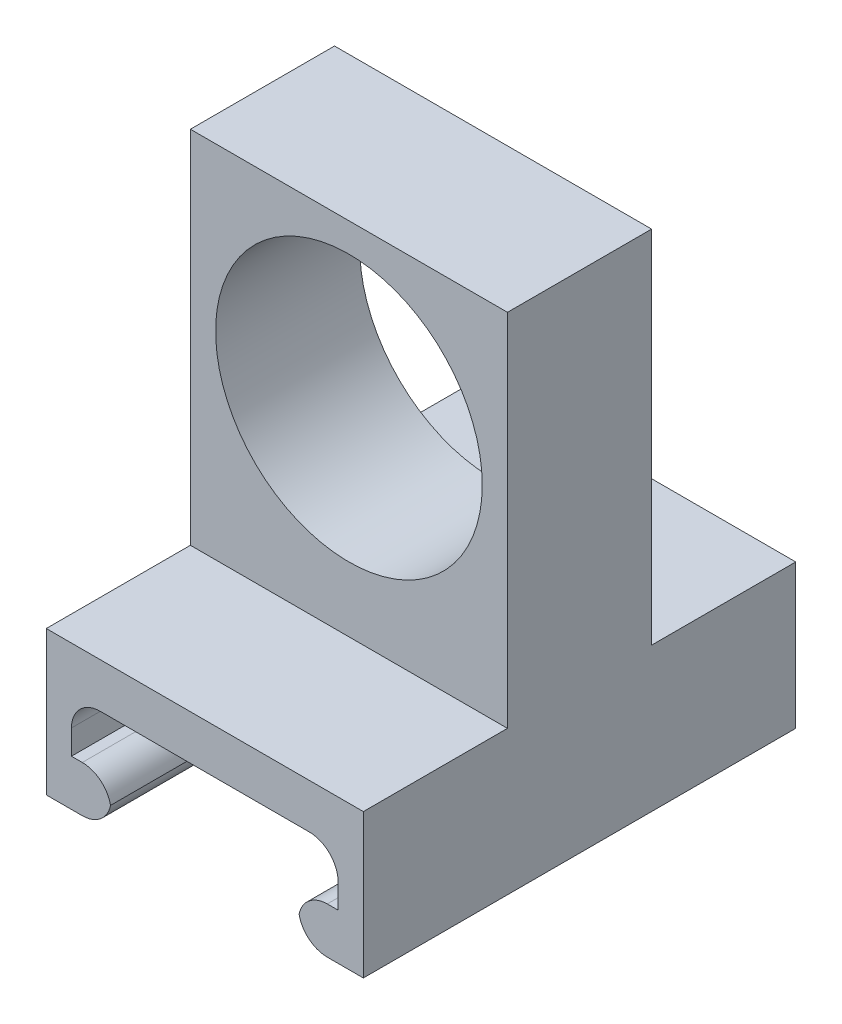
ISO-10303-21;
HEADER;
FILE_DESCRIPTION(('STEP AP214'),'2;1');
FILE_NAME('part.step','',(''),(''),'','','');
FILE_SCHEMA(('AUTOMOTIVE_DESIGN { 1 0 10303 214 1 1 1 1 }'));
ENDSEC;
DATA;
#1=APPLICATION_CONTEXT('core data for automotive mechanical design processes');
#2=APPLICATION_PROTOCOL_DEFINITION('international standard','automotive_design',2000,#1);
#3=PRODUCT_CONTEXT('',#1,'mechanical');
#4=PRODUCT('Part','Part','',(#3));
#5=PRODUCT_RELATED_PRODUCT_CATEGORY('part','',(#4));
#6=PRODUCT_DEFINITION_FORMATION('','',#4);
#7=PRODUCT_DEFINITION_CONTEXT('part definition',#1,'design');
#8=PRODUCT_DEFINITION('design','',#6,#7);
#9=PRODUCT_DEFINITION_SHAPE('','',#8);
#10=(LENGTH_UNIT() NAMED_UNIT(*) SI_UNIT(.MILLI.,.METRE.));
#11=(NAMED_UNIT(*) PLANE_ANGLE_UNIT() SI_UNIT($,.RADIAN.));
#12=(NAMED_UNIT(*) SI_UNIT($,.STERADIAN.) SOLID_ANGLE_UNIT());
#13=UNCERTAINTY_MEASURE_WITH_UNIT(LENGTH_MEASURE(1.E-05),#10,'distance_accuracy_value','');
#14=(GEOMETRIC_REPRESENTATION_CONTEXT(3) GLOBAL_UNCERTAINTY_ASSIGNED_CONTEXT((#13)) GLOBAL_UNIT_ASSIGNED_CONTEXT((#10,
#11,#12)) REPRESENTATION_CONTEXT('',''));
#15=CARTESIAN_POINT('',(0.,0.,0.));
#16=DIRECTION('',(0.,0.,1.));
#17=DIRECTION('',(1.,0.,0.));
#18=AXIS2_PLACEMENT_3D('',#15,#16,#17);
#19=CARTESIAN_POINT('',(0.,10.,0.));
#20=DIRECTION('',(0.,1.,0.));
#21=DIRECTION('',(0.,0.,1.));
#22=AXIS2_PLACEMENT_3D('',#19,#20,#21);
#23=PLANE('',#22);
#24=DIRECTION('',(1.,0.,0.));
#25=VECTOR('',#24,1.);
#26=CARTESIAN_POINT('',(-9.71320754716981,10.,11.677358490566));
#27=LINE('',#26,#25);
#28=CARTESIAN_POINT('',(-9.71320754716981,10.,11.677358490566));
#29=VERTEX_POINT('',#28);
#30=CARTESIAN_POINT('',(12.2867924528302,10.,11.677358490566));
#31=VERTEX_POINT('',#30);
#32=EDGE_CURVE('E192',#29,#31,#27,.T.);
#33=ORIENTED_EDGE('',*,*,#32,.F.);
#34=DIRECTION('',(0.,0.,1.));
#35=VECTOR('',#34,1.);
#36=CARTESIAN_POINT('',(-9.71320754716981,10.,-8.32264150943396));
#37=LINE('',#36,#35);
#38=CARTESIAN_POINT('',(-9.71320754716981,10.,21.677358490566));
#39=VERTEX_POINT('',#38);
#40=EDGE_CURVE('E240',#29,#39,#37,.T.);
#41=ORIENTED_EDGE('',*,*,#40,.T.);
#42=DIRECTION('',(1.,0.,0.));
#43=VECTOR('',#42,1.);
#44=CARTESIAN_POINT('',(-9.71320754716981,10.,21.677358490566));
#45=LINE('',#44,#43);
#46=CARTESIAN_POINT('',(12.2867924528302,10.,21.677358490566));
#47=VERTEX_POINT('',#46);
#48=EDGE_CURVE('E239',#39,#47,#45,.T.);
#49=ORIENTED_EDGE('',*,*,#48,.T.);
#50=DIRECTION('',(0.,0.,-1.));
#51=VECTOR('',#50,1.);
#52=CARTESIAN_POINT('',(12.2867924528302,10.,-8.32264150943396));
#53=LINE('',#52,#51);
#54=EDGE_CURVE('E60',#47,#31,#53,.T.);
#55=ORIENTED_EDGE('',*,*,#54,.T.);
#56=EDGE_LOOP('',(#33,#41,#49,#55));
#57=FACE_BOUND('',#56,.T.);
#58=ADVANCED_FACE('F35',(#57),#23,.T.);
#59=CARTESIAN_POINT('',(0.,0.,0.));
#60=DIRECTION('',(0.,1.,0.));
#61=DIRECTION('',(0.,0.,1.));
#62=AXIS2_PLACEMENT_3D('',#59,#60,#61);
#63=PLANE('',#62);
#64=DIRECTION('',(1.,0.,0.));
#65=VECTOR('',#64,1.);
#66=CARTESIAN_POINT('',(-9.71320754716981,0.,21.677358490566));
#67=LINE('',#66,#65);
#68=CARTESIAN_POINT('',(9.78679245283019,0.,21.677358490566));
#69=VERTEX_POINT('',#68);
#70=CARTESIAN_POINT('',(12.2867924528302,0.,21.677358490566));
#71=VERTEX_POINT('',#70);
#72=EDGE_CURVE('E248',#69,#71,#67,.T.);
#73=ORIENTED_EDGE('',*,*,#72,.F.);
#74=DIRECTION('',(0.,0.,1.));
#75=VECTOR('',#74,1.);
#76=CARTESIAN_POINT('',(9.78679245283019,0.,0.));
#77=LINE('',#76,#75);
#78=CARTESIAN_POINT('',(9.78679245283019,0.,-8.32264150943396));
#79=VERTEX_POINT('',#78);
#80=EDGE_CURVE('E298',#69,#79,#77,.F.);
#81=ORIENTED_EDGE('',*,*,#80,.T.);
#82=DIRECTION('',(-1.,0.,0.));
#83=VECTOR('',#82,1.);
#84=CARTESIAN_POINT('',(-9.71320754716981,0.,-8.32264150943396));
#85=LINE('',#84,#83);
#86=CARTESIAN_POINT('',(12.2867924528302,0.,-8.32264150943396));
#87=VERTEX_POINT('',#86);
#88=EDGE_CURVE('E255',#87,#79,#85,.T.);
#89=ORIENTED_EDGE('',*,*,#88,.F.);
#90=DIRECTION('',(0.,0.,-1.));
#91=VECTOR('',#90,1.);
#92=CARTESIAN_POINT('',(12.2867924528302,0.,-8.32264150943396));
#93=LINE('',#92,#91);
#94=EDGE_CURVE('E252',#71,#87,#93,.T.);
#95=ORIENTED_EDGE('',*,*,#94,.F.);
#96=EDGE_LOOP('',(#73,#81,#89,#95));
#97=FACE_BOUND('',#96,.T.);
#98=ADVANCED_FACE('F369',(#97),#63,.F.);
#99=CARTESIAN_POINT('',(-9.71320754716981,10.,-8.32264150943396));
#100=DIRECTION('',(1.,0.,0.));
#101=DIRECTION('',(0.,0.,-1.));
#102=AXIS2_PLACEMENT_3D('',#99,#100,#101);
#103=PLANE('',#102);
#104=DIRECTION('',(0.,0.,1.));
#105=VECTOR('',#104,1.);
#106=CARTESIAN_POINT('',(-9.71320754716981,0.,-8.32264150943396));
#107=LINE('',#106,#105);
#108=CARTESIAN_POINT('',(-9.71320754716981,0.,-8.32264150943396));
#109=VERTEX_POINT('',#108);
#110=CARTESIAN_POINT('',(-9.71320754716981,0.,21.677358490566));
#111=VERTEX_POINT('',#110);
#112=EDGE_CURVE('E234',#109,#111,#107,.T.);
#113=ORIENTED_EDGE('',*,*,#112,.T.);
#114=DIRECTION('',(0.,-1.,0.));
#115=VECTOR('',#114,1.);
#116=CARTESIAN_POINT('',(-9.71320754716981,10.,21.677358490566));
#117=LINE('',#116,#115);
#118=EDGE_CURVE('E266',#39,#111,#117,.T.);
#119=ORIENTED_EDGE('',*,*,#118,.F.);
#120=ORIENTED_EDGE('',*,*,#40,.F.);
#121=DIRECTION('',(0.,-1.,0.));
#122=VECTOR('',#121,1.);
#123=CARTESIAN_POINT('',(-9.71320754716981,35.,11.677358490566));
#124=LINE('',#123,#122);
#125=CARTESIAN_POINT('',(-9.71320754716981,35.,11.677358490566));
#126=VERTEX_POINT('',#125);
#127=EDGE_CURVE('E200',#126,#29,#124,.T.);
#128=ORIENTED_EDGE('',*,*,#127,.F.);
#129=DIRECTION('',(0.,0.,1.));
#130=VECTOR('',#129,1.);
#131=CARTESIAN_POINT('',(-9.71320754716981,35.,11.677358490566));
#132=LINE('',#131,#130);
#133=CARTESIAN_POINT('',(-9.71320754716981,35.,1.67735849056604));
#134=VERTEX_POINT('',#133);
#135=EDGE_CURVE('E182',#134,#126,#132,.T.);
#136=ORIENTED_EDGE('',*,*,#135,.F.);
#137=DIRECTION('',(0.,-1.,0.));
#138=VECTOR('',#137,1.);
#139=CARTESIAN_POINT('',(-9.71320754716981,35.,1.67735849056604));
#140=LINE('',#139,#138);
#141=CARTESIAN_POINT('',(-9.71320754716981,10.,1.67735849056604));
#142=VERTEX_POINT('',#141);
#143=EDGE_CURVE('E179',#134,#142,#140,.T.);
#144=ORIENTED_EDGE('',*,*,#143,.T.);
#145=CARTESIAN_POINT('',(-9.71320754716981,10.,-8.32264150943396));
#146=VERTEX_POINT('',#145);
#147=EDGE_CURVE('E237',#146,#142,#37,.T.);
#148=ORIENTED_EDGE('',*,*,#147,.F.);
#149=DIRECTION('',(0.,-1.,0.));
#150=VECTOR('',#149,1.);
#151=CARTESIAN_POINT('',(-9.71320754716981,10.,-8.32264150943396));
#152=LINE('',#151,#150);
#153=EDGE_CURVE('E245',#146,#109,#152,.T.);
#154=ORIENTED_EDGE('',*,*,#153,.T.);
#155=EDGE_LOOP('',(#113,#119,#120,#128,#136,#144,#148,#154));
#156=FACE_BOUND('',#155,.T.);
#157=ADVANCED_FACE('F378',(#156),#103,.F.);
#158=CARTESIAN_POINT('',(-9.71320754716981,10.,21.677358490566));
#159=DIRECTION('',(0.,0.,-1.));
#160=DIRECTION('',(-1.,0.,0.));
#161=AXIS2_PLACEMENT_3D('',#158,#159,#160);
#162=PLANE('',#161);
#163=CARTESIAN_POINT('',(9.78679245283019,1.2,21.677358490566));
#164=DIRECTION('',(0.,0.,-1.));
#165=DIRECTION('',(-1.,0.,0.));
#166=AXIS2_PLACEMENT_3D('',#163,#164,#165);
#167=CIRCLE('',#166,2.);
#168=CARTESIAN_POINT('',(9.78679245283019,3.2,21.677358490566));
#169=VERTEX_POINT('',#168);
#170=CARTESIAN_POINT('',(7.82720065860365,1.6,21.677358490566));
#171=VERTEX_POINT('',#170);
#172=EDGE_CURVE('E286',#169,#171,#167,.F.);
#173=ORIENTED_EDGE('',*,*,#172,.T.);
#174=CARTESIAN_POINT('',(9.78679245283019,2.,21.677358490566));
#175=DIRECTION('',(0.,0.,-1.));
#176=DIRECTION('',(-1.,0.,0.));
#177=AXIS2_PLACEMENT_3D('',#174,#175,#176);
#178=CIRCLE('',#177,2.);
#179=EDGE_CURVE('E288',#171,#69,#178,.F.);
#180=ORIENTED_EDGE('',*,*,#179,.T.);
#181=ORIENTED_EDGE('',*,*,#72,.T.);
#182=DIRECTION('',(0.,-1.,0.));
#183=VECTOR('',#182,1.);
#184=CARTESIAN_POINT('',(12.2867924528302,10.,21.677358490566));
#185=LINE('',#184,#183);
#186=EDGE_CURVE('E263',#47,#71,#185,.T.);
#187=ORIENTED_EDGE('',*,*,#186,.F.);
#188=ORIENTED_EDGE('',*,*,#48,.F.);
#189=ORIENTED_EDGE('',*,*,#118,.T.);
#190=CARTESIAN_POINT('',(-7.21320754716981,0.,21.677358490566));
#191=VERTEX_POINT('',#190);
#192=EDGE_CURVE('E249',#111,#191,#67,.T.);
#193=ORIENTED_EDGE('',*,*,#192,.T.);
#194=CARTESIAN_POINT('',(-7.21320754716981,2.,21.677358490566));
#195=DIRECTION('',(0.,0.,-1.));
#196=DIRECTION('',(-1.,0.,0.));
#197=AXIS2_PLACEMENT_3D('',#194,#195,#196);
#198=CIRCLE('',#197,2.);
#199=CARTESIAN_POINT('',(-5.25361575294326,1.6,21.677358490566));
#200=VERTEX_POINT('',#199);
#201=EDGE_CURVE('E284',#191,#200,#198,.F.);
#202=ORIENTED_EDGE('',*,*,#201,.T.);
#203=CARTESIAN_POINT('',(-7.21320754716981,1.2,21.677358490566));
#204=DIRECTION('',(0.,0.,-1.));
#205=DIRECTION('',(-1.,0.,0.));
#206=AXIS2_PLACEMENT_3D('',#203,#204,#205);
#207=CIRCLE('',#206,2.);
#208=CARTESIAN_POINT('',(-7.21320754716981,3.2,21.677358490566));
#209=VERTEX_POINT('',#208);
#210=EDGE_CURVE('E282',#200,#209,#207,.F.);
#211=ORIENTED_EDGE('',*,*,#210,.T.);
#212=DIRECTION('',(1.,0.,0.));
#213=VECTOR('',#212,1.);
#214=CARTESIAN_POINT('',(-7.96320754716981,3.2,21.677358490566));
#215=LINE('',#214,#213);
#216=CARTESIAN_POINT('',(-7.96320754716981,3.2,21.677358490566));
#217=VERTEX_POINT('',#216);
#218=EDGE_CURVE('E221',#217,#209,#215,.T.);
#219=ORIENTED_EDGE('',*,*,#218,.F.);
#220=DIRECTION('',(0.,-1.,0.));
#221=VECTOR('',#220,1.);
#222=CARTESIAN_POINT('',(-7.96320754716981,6.9,21.677358490566));
#223=LINE('',#222,#221);
#224=CARTESIAN_POINT('',(-7.96320754716981,4.9,21.677358490566));
#225=VERTEX_POINT('',#224);
#226=EDGE_CURVE('E219',#225,#217,#223,.T.);
#227=ORIENTED_EDGE('',*,*,#226,.F.);
#228=CARTESIAN_POINT('',(-5.96320754716981,4.9,21.677358490566));
#229=DIRECTION('',(0.,0.,-1.));
#230=DIRECTION('',(-1.,0.,0.));
#231=AXIS2_PLACEMENT_3D('',#228,#229,#230);
#232=CIRCLE('',#231,2.);
#233=CARTESIAN_POINT('',(-5.96320754716981,6.9,21.677358490566));
#234=VERTEX_POINT('',#233);
#235=EDGE_CURVE('E44',#225,#234,#232,.T.);
#236=ORIENTED_EDGE('',*,*,#235,.T.);
#237=DIRECTION('',(-1.,0.,0.));
#238=VECTOR('',#237,1.);
#239=CARTESIAN_POINT('',(-7.96320754716981,6.9,21.677358490566));
#240=LINE('',#239,#238);
#241=CARTESIAN_POINT('',(8.53679245283019,6.9,21.677358490566));
#242=VERTEX_POINT('',#241);
#243=EDGE_CURVE('E207',#242,#234,#240,.T.);
#244=ORIENTED_EDGE('',*,*,#243,.F.);
#245=CARTESIAN_POINT('',(8.53679245283019,4.9,21.677358490566));
#246=DIRECTION('',(0.,0.,-1.));
#247=DIRECTION('',(-1.,0.,0.));
#248=AXIS2_PLACEMENT_3D('',#245,#246,#247);
#249=CIRCLE('',#248,2.);
#250=CARTESIAN_POINT('',(10.5367924528302,4.9,21.677358490566));
#251=VERTEX_POINT('',#250);
#252=EDGE_CURVE('E305',#242,#251,#249,.T.);
#253=ORIENTED_EDGE('',*,*,#252,.T.);
#254=DIRECTION('',(0.,1.,0.));
#255=VECTOR('',#254,1.);
#256=CARTESIAN_POINT('',(10.5367924528302,6.9,21.677358490566));
#257=LINE('',#256,#255);
#258=CARTESIAN_POINT('',(10.5367924528302,3.2,21.677358490566));
#259=VERTEX_POINT('',#258);
#260=EDGE_CURVE('E226',#259,#251,#257,.T.);
#261=ORIENTED_EDGE('',*,*,#260,.F.);
#262=DIRECTION('',(1.,0.,0.));
#263=VECTOR('',#262,1.);
#264=CARTESIAN_POINT('',(7.78679245283019,3.2,21.677358490566));
#265=LINE('',#264,#263);
#266=EDGE_CURVE('E224',#169,#259,#265,.T.);
#267=ORIENTED_EDGE('',*,*,#266,.F.);
#268=EDGE_LOOP('',(#173,#180,#181,#187,#188,#189,#193,#202,#211,#219,#227,#236,#244,#253,#261,#267));
#269=FACE_BOUND('',#268,.T.);
#270=ADVANCED_FACE('F322',(#269),#162,.F.);
#271=CARTESIAN_POINT('',(12.2867924528302,10.,-8.32264150943396));
#272=DIRECTION('',(-1.,0.,0.));
#273=DIRECTION('',(0.,0.,1.));
#274=AXIS2_PLACEMENT_3D('',#271,#272,#273);
#275=PLANE('',#274);
#276=ORIENTED_EDGE('',*,*,#94,.T.);
#277=DIRECTION('',(0.,-1.,0.));
#278=VECTOR('',#277,1.);
#279=CARTESIAN_POINT('',(12.2867924528302,10.,-8.32264150943396));
#280=LINE('',#279,#278);
#281=CARTESIAN_POINT('',(12.2867924528302,10.,-8.32264150943396));
#282=VERTEX_POINT('',#281);
#283=EDGE_CURVE('E260',#282,#87,#280,.T.);
#284=ORIENTED_EDGE('',*,*,#283,.F.);
#285=CARTESIAN_POINT('',(12.2867924528302,10.,1.67735849056604));
#286=VERTEX_POINT('',#285);
#287=EDGE_CURVE('E196',#286,#282,#53,.T.);
#288=ORIENTED_EDGE('',*,*,#287,.F.);
#289=DIRECTION('',(0.,-1.,0.));
#290=VECTOR('',#289,1.);
#291=CARTESIAN_POINT('',(12.2867924528302,35.,1.67735849056604));
#292=LINE('',#291,#290);
#293=CARTESIAN_POINT('',(12.2867924528302,35.,1.67735849056604));
#294=VERTEX_POINT('',#293);
#295=EDGE_CURVE('E177',#294,#286,#292,.T.);
#296=ORIENTED_EDGE('',*,*,#295,.F.);
#297=DIRECTION('',(0.,0.,-1.));
#298=VECTOR('',#297,1.);
#299=CARTESIAN_POINT('',(12.2867924528302,35.,11.677358490566));
#300=LINE('',#299,#298);
#301=CARTESIAN_POINT('',(12.2867924528302,35.,11.677358490566));
#302=VERTEX_POINT('',#301);
#303=EDGE_CURVE('E183',#302,#294,#300,.T.);
#304=ORIENTED_EDGE('',*,*,#303,.F.);
#305=DIRECTION('',(0.,-1.,0.));
#306=VECTOR('',#305,1.);
#307=CARTESIAN_POINT('',(12.2867924528302,35.,11.677358490566));
#308=LINE('',#307,#306);
#309=EDGE_CURVE('E383',#302,#31,#308,.T.);
#310=ORIENTED_EDGE('',*,*,#309,.T.);
#311=ORIENTED_EDGE('',*,*,#54,.F.);
#312=ORIENTED_EDGE('',*,*,#186,.T.);
#313=EDGE_LOOP('',(#276,#284,#288,#296,#304,#310,#311,#312));
#314=FACE_BOUND('',#313,.T.);
#315=ADVANCED_FACE('F194',(#314),#275,.F.);
#316=CARTESIAN_POINT('',(-9.71320754716981,10.,-8.32264150943396));
#317=DIRECTION('',(0.,0.,1.));
#318=DIRECTION('',(1.,0.,0.));
#319=AXIS2_PLACEMENT_3D('',#316,#317,#318);
#320=PLANE('',#319);
#321=ORIENTED_EDGE('',*,*,#88,.T.);
#322=CARTESIAN_POINT('',(9.78679245283019,2.,-8.32264150943396));
#323=DIRECTION('',(0.,0.,1.));
#324=DIRECTION('',(1.,0.,0.));
#325=AXIS2_PLACEMENT_3D('',#322,#323,#324);
#326=CIRCLE('',#325,2.);
#327=CARTESIAN_POINT('',(7.82720065860365,1.6,-8.32264150943396));
#328=VERTEX_POINT('',#327);
#329=EDGE_CURVE('E296',#79,#328,#326,.F.);
#330=ORIENTED_EDGE('',*,*,#329,.T.);
#331=CARTESIAN_POINT('',(9.78679245283019,1.2,-8.32264150943396));
#332=DIRECTION('',(0.,0.,1.));
#333=DIRECTION('',(1.,0.,0.));
#334=AXIS2_PLACEMENT_3D('',#331,#332,#333);
#335=CIRCLE('',#334,2.);
#336=CARTESIAN_POINT('',(9.78679245283019,3.2,-8.32264150943396));
#337=VERTEX_POINT('',#336);
#338=EDGE_CURVE('E294',#328,#337,#335,.F.);
#339=ORIENTED_EDGE('',*,*,#338,.T.);
#340=DIRECTION('',(1.,0.,0.));
#341=VECTOR('',#340,1.);
#342=CARTESIAN_POINT('',(7.78679245283019,3.2,-8.32264150943396));
#343=LINE('',#342,#341);
#344=CARTESIAN_POINT('',(10.5367924528302,3.2,-8.32264150943396));
#345=VERTEX_POINT('',#344);
#346=EDGE_CURVE('E210',#337,#345,#343,.T.);
#347=ORIENTED_EDGE('',*,*,#346,.T.);
#348=DIRECTION('',(0.,1.,0.));
#349=VECTOR('',#348,1.);
#350=CARTESIAN_POINT('',(10.5367924528302,6.9,-8.32264150943396));
#351=LINE('',#350,#349);
#352=CARTESIAN_POINT('',(10.5367924528302,4.9,-8.32264150943396));
#353=VERTEX_POINT('',#352);
#354=EDGE_CURVE('E212',#345,#353,#351,.T.);
#355=ORIENTED_EDGE('',*,*,#354,.T.);
#356=CARTESIAN_POINT('',(8.53679245283019,4.9,-8.32264150943396));
#357=DIRECTION('',(0.,0.,1.));
#358=DIRECTION('',(1.,0.,0.));
#359=AXIS2_PLACEMENT_3D('',#356,#357,#358);
#360=CIRCLE('',#359,2.);
#361=CARTESIAN_POINT('',(8.53679245283019,6.9,-8.32264150943396));
#362=VERTEX_POINT('',#361);
#363=EDGE_CURVE('E307',#353,#362,#360,.T.);
#364=ORIENTED_EDGE('',*,*,#363,.T.);
#365=DIRECTION('',(-1.,0.,0.));
#366=VECTOR('',#365,1.);
#367=CARTESIAN_POINT('',(-7.96320754716981,6.9,-8.32264150943396));
#368=LINE('',#367,#366);
#369=CARTESIAN_POINT('',(-5.96320754716981,6.9,-8.32264150943396));
#370=VERTEX_POINT('',#369);
#371=EDGE_CURVE('E215',#362,#370,#368,.T.);
#372=ORIENTED_EDGE('',*,*,#371,.T.);
#373=CARTESIAN_POINT('',(-5.96320754716981,4.9,-8.32264150943396));
#374=DIRECTION('',(0.,0.,1.));
#375=DIRECTION('',(1.,0.,0.));
#376=AXIS2_PLACEMENT_3D('',#373,#374,#375);
#377=CIRCLE('',#376,2.);
#378=CARTESIAN_POINT('',(-7.96320754716981,4.9,-8.32264150943396));
#379=VERTEX_POINT('',#378);
#380=EDGE_CURVE('E11',#370,#379,#377,.T.);
#381=ORIENTED_EDGE('',*,*,#380,.T.);
#382=DIRECTION('',(0.,-1.,0.));
#383=VECTOR('',#382,1.);
#384=CARTESIAN_POINT('',(-7.96320754716981,6.9,-8.32264150943396));
#385=LINE('',#384,#383);
#386=CARTESIAN_POINT('',(-7.96320754716981,3.2,-8.32264150943396));
#387=VERTEX_POINT('',#386);
#388=EDGE_CURVE('E204',#379,#387,#385,.T.);
#389=ORIENTED_EDGE('',*,*,#388,.T.);
#390=DIRECTION('',(1.,0.,0.));
#391=VECTOR('',#390,1.);
#392=CARTESIAN_POINT('',(-7.96320754716981,3.2,-8.32264150943396));
#393=LINE('',#392,#391);
#394=CARTESIAN_POINT('',(-7.21320754716981,3.2,-8.32264150943396));
#395=VERTEX_POINT('',#394);
#396=EDGE_CURVE('E206',#387,#395,#393,.T.);
#397=ORIENTED_EDGE('',*,*,#396,.T.);
#398=CARTESIAN_POINT('',(-7.21320754716981,1.2,-8.32264150943396));
#399=DIRECTION('',(0.,0.,1.));
#400=DIRECTION('',(1.,0.,0.));
#401=AXIS2_PLACEMENT_3D('',#398,#399,#400);
#402=CIRCLE('',#401,2.);
#403=CARTESIAN_POINT('',(-5.25361575294326,1.6,-8.32264150943396));
#404=VERTEX_POINT('',#403);
#405=EDGE_CURVE('E290',#395,#404,#402,.F.);
#406=ORIENTED_EDGE('',*,*,#405,.T.);
#407=CARTESIAN_POINT('',(-7.21320754716981,2.,-8.32264150943396));
#408=DIRECTION('',(0.,0.,1.));
#409=DIRECTION('',(1.,0.,0.));
#410=AXIS2_PLACEMENT_3D('',#407,#408,#409);
#411=CIRCLE('',#410,2.);
#412=CARTESIAN_POINT('',(-7.21320754716981,0.,-8.32264150943396));
#413=VERTEX_POINT('',#412);
#414=EDGE_CURVE('E292',#404,#413,#411,.F.);
#415=ORIENTED_EDGE('',*,*,#414,.T.);
#416=EDGE_CURVE('E254',#413,#109,#85,.T.);
#417=ORIENTED_EDGE('',*,*,#416,.T.);
#418=ORIENTED_EDGE('',*,*,#153,.F.);
#419=DIRECTION('',(-1.,0.,0.));
#420=VECTOR('',#419,1.);
#421=CARTESIAN_POINT('',(-9.71320754716981,10.,-8.32264150943396));
#422=LINE('',#421,#420);
#423=EDGE_CURVE('E243',#282,#146,#422,.T.);
#424=ORIENTED_EDGE('',*,*,#423,.F.);
#425=ORIENTED_EDGE('',*,*,#283,.T.);
#426=EDGE_LOOP('',(#321,#330,#339,#347,#355,#364,#372,#381,#389,#397,#406,#415,#417,#418,#424,#425));
#427=FACE_BOUND('',#426,.T.);
#428=ADVANCED_FACE('F342',(#427),#320,.F.);
#429=DIRECTION('',(-1.,0.,0.));
#430=VECTOR('',#429,1.);
#431=CARTESIAN_POINT('',(-9.71320754716981,10.,1.67735849056604));
#432=LINE('',#431,#430);
#433=EDGE_CURVE('E52',#286,#142,#432,.T.);
#434=ORIENTED_EDGE('',*,*,#433,.F.);
#435=ORIENTED_EDGE('',*,*,#287,.T.);
#436=ORIENTED_EDGE('',*,*,#423,.T.);
#437=ORIENTED_EDGE('',*,*,#147,.T.);
#438=EDGE_LOOP('',(#434,#435,#436,#437));
#439=FACE_BOUND('',#438,.T.);
#440=ADVANCED_FACE('F374',(#439),#23,.T.);
#441=ORIENTED_EDGE('',*,*,#416,.F.);
#442=DIRECTION('',(0.,0.,1.));
#443=VECTOR('',#442,1.);
#444=CARTESIAN_POINT('',(-7.21320754716981,0.,0.));
#445=LINE('',#444,#443);
#446=EDGE_CURVE('E279',#413,#191,#445,.T.);
#447=ORIENTED_EDGE('',*,*,#446,.T.);
#448=ORIENTED_EDGE('',*,*,#192,.F.);
#449=ORIENTED_EDGE('',*,*,#112,.F.);
#450=EDGE_LOOP('',(#441,#447,#448,#449));
#451=FACE_BOUND('',#450,.T.);
#452=ADVANCED_FACE('F394',(#451),#63,.F.);
#453=CARTESIAN_POINT('',(-7.96320754716981,6.9,-8.32264150943396));
#454=DIRECTION('',(-1.,0.,0.));
#455=DIRECTION('',(0.,-1.,0.));
#456=AXIS2_PLACEMENT_3D('',#453,#454,#455);
#457=PLANE('',#456);
#458=ORIENTED_EDGE('',*,*,#388,.F.);
#459=DIRECTION('',(0.,0.,1.));
#460=VECTOR('',#459,1.);
#461=CARTESIAN_POINT('',(-7.96320754716981,4.9,21.677358490566));
#462=LINE('',#461,#460);
#463=EDGE_CURVE('E276',#379,#225,#462,.T.);
#464=ORIENTED_EDGE('',*,*,#463,.T.);
#465=ORIENTED_EDGE('',*,*,#226,.T.);
#466=DIRECTION('',(0.,0.,1.));
#467=VECTOR('',#466,1.);
#468=CARTESIAN_POINT('',(-7.96320754716981,3.2,-8.32264150943396));
#469=LINE('',#468,#467);
#470=EDGE_CURVE('E218',#387,#217,#469,.T.);
#471=ORIENTED_EDGE('',*,*,#470,.F.);
#472=EDGE_LOOP('',(#458,#464,#465,#471));
#473=FACE_BOUND('',#472,.T.);
#474=ADVANCED_FACE('F330',(#473),#457,.F.);
#475=CARTESIAN_POINT('',(-7.96320754716981,6.9,-8.32264150943396));
#476=DIRECTION('',(0.,1.,0.));
#477=DIRECTION('',(-1.,0.,0.));
#478=AXIS2_PLACEMENT_3D('',#475,#476,#477);
#479=PLANE('',#478);
#480=ORIENTED_EDGE('',*,*,#371,.F.);
#481=DIRECTION('',(0.,0.,1.));
#482=VECTOR('',#481,1.);
#483=CARTESIAN_POINT('',(8.53679245283019,6.9,21.677358490566));
#484=LINE('',#483,#482);
#485=EDGE_CURVE('E271',#362,#242,#484,.T.);
#486=ORIENTED_EDGE('',*,*,#485,.T.);
#487=ORIENTED_EDGE('',*,*,#243,.T.);
#488=DIRECTION('',(0.,0.,1.));
#489=VECTOR('',#488,1.);
#490=CARTESIAN_POINT('',(-5.96320754716981,6.9,-8.32264150943396));
#491=LINE('',#490,#489);
#492=EDGE_CURVE('E269',#234,#370,#491,.F.);
#493=ORIENTED_EDGE('',*,*,#492,.T.);
#494=EDGE_LOOP('',(#480,#486,#487,#493));
#495=FACE_BOUND('',#494,.T.);
#496=ADVANCED_FACE('F337',(#495),#479,.F.);
#497=CARTESIAN_POINT('',(10.5367924528302,6.9,-8.32264150943396));
#498=DIRECTION('',(1.,0.,0.));
#499=DIRECTION('',(0.,1.,0.));
#500=AXIS2_PLACEMENT_3D('',#497,#498,#499);
#501=PLANE('',#500);
#502=ORIENTED_EDGE('',*,*,#260,.T.);
#503=DIRECTION('',(0.,0.,1.));
#504=VECTOR('',#503,1.);
#505=CARTESIAN_POINT('',(10.5367924528302,4.9,-8.32264150943396));
#506=LINE('',#505,#504);
#507=EDGE_CURVE('E274',#251,#353,#506,.F.);
#508=ORIENTED_EDGE('',*,*,#507,.T.);
#509=ORIENTED_EDGE('',*,*,#354,.F.);
#510=DIRECTION('',(0.,0.,1.));
#511=VECTOR('',#510,1.);
#512=CARTESIAN_POINT('',(10.5367924528302,3.2,-8.32264150943396));
#513=LINE('',#512,#511);
#514=EDGE_CURVE('E231',#345,#259,#513,.T.);
#515=ORIENTED_EDGE('',*,*,#514,.T.);
#516=EDGE_LOOP('',(#502,#508,#509,#515));
#517=FACE_BOUND('',#516,.T.);
#518=ADVANCED_FACE('F350',(#517),#501,.F.);
#519=CARTESIAN_POINT('',(7.78679245283019,3.2,-8.32264150943396));
#520=DIRECTION('',(0.,-1.,0.));
#521=DIRECTION('',(1.,0.,0.));
#522=AXIS2_PLACEMENT_3D('',#519,#520,#521);
#523=PLANE('',#522);
#524=ORIENTED_EDGE('',*,*,#346,.F.);
#525=DIRECTION('',(0.,0.,1.));
#526=VECTOR('',#525,1.);
#527=CARTESIAN_POINT('',(9.78679245283019,3.2,-8.32264150943396));
#528=LINE('',#527,#526);
#529=EDGE_CURVE('E301',#337,#169,#528,.T.);
#530=ORIENTED_EDGE('',*,*,#529,.T.);
#531=ORIENTED_EDGE('',*,*,#266,.T.);
#532=ORIENTED_EDGE('',*,*,#514,.F.);
#533=EDGE_LOOP('',(#524,#530,#531,#532));
#534=FACE_BOUND('',#533,.T.);
#535=ADVANCED_FACE('F355',(#534),#523,.F.);
#536=CARTESIAN_POINT('',(-7.96320754716981,3.2,-8.32264150943396));
#537=DIRECTION('',(0.,-1.,0.));
#538=DIRECTION('',(0.,0.,-1.));
#539=AXIS2_PLACEMENT_3D('',#536,#537,#538);
#540=PLANE('',#539);
#541=ORIENTED_EDGE('',*,*,#218,.T.);
#542=DIRECTION('',(0.,0.,1.));
#543=VECTOR('',#542,1.);
#544=CARTESIAN_POINT('',(-7.21320754716981,3.2,-8.32264150943396));
#545=LINE('',#544,#543);
#546=EDGE_CURVE('E303',#209,#395,#545,.F.);
#547=ORIENTED_EDGE('',*,*,#546,.T.);
#548=ORIENTED_EDGE('',*,*,#396,.F.);
#549=ORIENTED_EDGE('',*,*,#470,.T.);
#550=EDGE_LOOP('',(#541,#547,#548,#549));
#551=FACE_BOUND('',#550,.T.);
#552=ADVANCED_FACE('F325',(#551),#540,.F.);
#553=CARTESIAN_POINT('',(8.53679245283019,4.9,-8.32264150943396));
#554=DIRECTION('',(0.,0.,-1.));
#555=DIRECTION('',(-1.,0.,0.));
#556=AXIS2_PLACEMENT_3D('',#553,#554,#555);
#557=CYLINDRICAL_SURFACE('',#556,2.);
#558=ORIENTED_EDGE('',*,*,#363,.F.);
#559=ORIENTED_EDGE('',*,*,#507,.F.);
#560=ORIENTED_EDGE('',*,*,#252,.F.);
#561=ORIENTED_EDGE('',*,*,#485,.F.);
#562=EDGE_LOOP('',(#558,#559,#560,#561));
#563=FACE_BOUND('',#562,.T.);
#564=ADVANCED_FACE('F345',(#563),#557,.F.);
#565=CARTESIAN_POINT('',(-5.96320754716981,4.9,-8.32264150943396));
#566=DIRECTION('',(0.,0.,-1.));
#567=DIRECTION('',(-1.,0.,0.));
#568=AXIS2_PLACEMENT_3D('',#565,#566,#567);
#569=CYLINDRICAL_SURFACE('',#568,2.);
#570=ORIENTED_EDGE('',*,*,#380,.F.);
#571=ORIENTED_EDGE('',*,*,#492,.F.);
#572=ORIENTED_EDGE('',*,*,#235,.F.);
#573=ORIENTED_EDGE('',*,*,#463,.F.);
#574=EDGE_LOOP('',(#570,#571,#572,#573));
#575=FACE_BOUND('',#574,.T.);
#576=ADVANCED_FACE('F340',(#575),#569,.F.);
#577=CARTESIAN_POINT('',(-7.21320754716981,1.2,-8.32264150943396));
#578=DIRECTION('',(0.,0.,1.));
#579=DIRECTION('',(1.,0.,0.));
#580=AXIS2_PLACEMENT_3D('',#577,#578,#579);
#581=CYLINDRICAL_SURFACE('',#580,2.);
#582=DIRECTION('',(0.,0.,1.));
#583=VECTOR('',#582,1.);
#584=CARTESIAN_POINT('',(-5.25361575294327,1.6,6.67735849056604));
#585=LINE('',#584,#583);
#586=EDGE_CURVE('E199',#404,#200,#585,.T.);
#587=ORIENTED_EDGE('',*,*,#586,.F.);
#588=ORIENTED_EDGE('',*,*,#405,.F.);
#589=ORIENTED_EDGE('',*,*,#546,.F.);
#590=ORIENTED_EDGE('',*,*,#210,.F.);
#591=EDGE_LOOP('',(#587,#588,#589,#590));
#592=FACE_BOUND('',#591,.T.);
#593=ADVANCED_FACE('F318',(#592),#581,.T.);
#594=CARTESIAN_POINT('',(-7.21320754716981,2.,0.));
#595=DIRECTION('',(0.,0.,1.));
#596=DIRECTION('',(1.,0.,0.));
#597=AXIS2_PLACEMENT_3D('',#594,#595,#596);
#598=CYLINDRICAL_SURFACE('',#597,2.);
#599=ORIENTED_EDGE('',*,*,#414,.F.);
#600=ORIENTED_EDGE('',*,*,#586,.T.);
#601=ORIENTED_EDGE('',*,*,#201,.F.);
#602=ORIENTED_EDGE('',*,*,#446,.F.);
#603=EDGE_LOOP('',(#599,#600,#601,#602));
#604=FACE_BOUND('',#603,.T.);
#605=ADVANCED_FACE('F313',(#604),#598,.T.);
#606=CARTESIAN_POINT('',(9.78679245283019,1.2,-8.32264150943396));
#607=DIRECTION('',(0.,0.,1.));
#608=DIRECTION('',(1.,0.,0.));
#609=AXIS2_PLACEMENT_3D('',#606,#607,#608);
#610=CYLINDRICAL_SURFACE('',#609,2.);
#611=ORIENTED_EDGE('',*,*,#529,.F.);
#612=ORIENTED_EDGE('',*,*,#338,.F.);
#613=DIRECTION('',(0.,0.,1.));
#614=VECTOR('',#613,1.);
#615=CARTESIAN_POINT('',(7.82720065860365,1.6,6.67735849056604));
#616=LINE('',#615,#614);
#617=EDGE_CURVE('E39',#171,#328,#616,.F.);
#618=ORIENTED_EDGE('',*,*,#617,.F.);
#619=ORIENTED_EDGE('',*,*,#172,.F.);
#620=EDGE_LOOP('',(#611,#612,#618,#619));
#621=FACE_BOUND('',#620,.T.);
#622=ADVANCED_FACE('F37',(#621),#610,.T.);
#623=CARTESIAN_POINT('',(9.78679245283019,2.,-8.32264150943396));
#624=DIRECTION('',(0.,0.,1.));
#625=DIRECTION('',(1.,0.,0.));
#626=AXIS2_PLACEMENT_3D('',#623,#624,#625);
#627=CYLINDRICAL_SURFACE('',#626,2.);
#628=ORIENTED_EDGE('',*,*,#329,.F.);
#629=ORIENTED_EDGE('',*,*,#80,.F.);
#630=ORIENTED_EDGE('',*,*,#179,.F.);
#631=ORIENTED_EDGE('',*,*,#617,.T.);
#632=EDGE_LOOP('',(#628,#629,#630,#631));
#633=FACE_BOUND('',#632,.T.);
#634=ADVANCED_FACE('F364',(#633),#627,.T.);
#635=CARTESIAN_POINT('',(-9.71320754716981,35.,1.67735849056604));
#636=DIRECTION('',(0.,0.,1.));
#637=DIRECTION('',(1.,0.,0.));
#638=AXIS2_PLACEMENT_3D('',#635,#636,#637);
#639=PLANE('',#638);
#640=CARTESIAN_POINT('',(1.28679245283019,23.746,1.67735849056604));
#641=DIRECTION('',(0.,0.,1.));
#642=DIRECTION('',(1.,0.,0.));
#643=AXIS2_PLACEMENT_3D('',#640,#641,#642);
#644=CIRCLE('',#643,9.25);
#645=CARTESIAN_POINT('',(10.5367924528302,23.746,1.67735849056604));
#646=VERTEX_POINT('',#645);
#647=EDGE_CURVE('E376',#646,#646,#644,.F.);
#648=ORIENTED_EDGE('',*,*,#647,.F.);
#649=EDGE_LOOP('',(#648));
#650=FACE_BOUND('',#649,.T.);
#651=ORIENTED_EDGE('',*,*,#433,.T.);
#652=ORIENTED_EDGE('',*,*,#143,.F.);
#653=DIRECTION('',(-1.,0.,0.));
#654=VECTOR('',#653,1.);
#655=CARTESIAN_POINT('',(-9.71320754716981,35.,1.67735849056604));
#656=LINE('',#655,#654);
#657=EDGE_CURVE('E173',#294,#134,#656,.T.);
#658=ORIENTED_EDGE('',*,*,#657,.F.);
#659=ORIENTED_EDGE('',*,*,#295,.T.);
#660=EDGE_LOOP('',(#651,#652,#658,#659));
#661=FACE_BOUND('',#660,.T.);
#662=ADVANCED_FACE('F175',(#650,#661),#639,.F.);
#663=CARTESIAN_POINT('',(-9.71320754716981,35.,11.677358490566));
#664=DIRECTION('',(0.,0.,-1.));
#665=DIRECTION('',(-1.,0.,0.));
#666=AXIS2_PLACEMENT_3D('',#663,#664,#665);
#667=PLANE('',#666);
#668=CARTESIAN_POINT('',(1.28679245283019,23.746,11.677358490566));
#669=DIRECTION('',(0.,0.,1.));
#670=DIRECTION('',(1.,0.,0.));
#671=AXIS2_PLACEMENT_3D('',#668,#669,#670);
#672=CIRCLE('',#671,9.25);
#673=CARTESIAN_POINT('',(10.5367924528302,23.746,11.677358490566));
#674=VERTEX_POINT('',#673);
#675=EDGE_CURVE('E433',#674,#674,#672,.T.);
#676=ORIENTED_EDGE('',*,*,#675,.F.);
#677=EDGE_LOOP('',(#676));
#678=FACE_BOUND('',#677,.T.);
#679=ORIENTED_EDGE('',*,*,#32,.T.);
#680=ORIENTED_EDGE('',*,*,#309,.F.);
#681=DIRECTION('',(1.,0.,0.));
#682=VECTOR('',#681,1.);
#683=CARTESIAN_POINT('',(-9.71320754716981,35.,11.677358490566));
#684=LINE('',#683,#682);
#685=EDGE_CURVE('E188',#126,#302,#684,.T.);
#686=ORIENTED_EDGE('',*,*,#685,.F.);
#687=ORIENTED_EDGE('',*,*,#127,.T.);
#688=EDGE_LOOP('',(#679,#680,#686,#687));
#689=FACE_BOUND('',#688,.T.);
#690=ADVANCED_FACE('F388',(#678,#689),#667,.F.);
#691=CARTESIAN_POINT('',(0.,35.,0.));
#692=DIRECTION('',(0.,-1.,0.));
#693=DIRECTION('',(0.,0.,-1.));
#694=AXIS2_PLACEMENT_3D('',#691,#692,#693);
#695=PLANE('',#694);
#696=ORIENTED_EDGE('',*,*,#303,.T.);
#697=ORIENTED_EDGE('',*,*,#657,.T.);
#698=ORIENTED_EDGE('',*,*,#135,.T.);
#699=ORIENTED_EDGE('',*,*,#685,.T.);
#700=EDGE_LOOP('',(#696,#697,#698,#699));
#701=FACE_BOUND('',#700,.T.);
#702=ADVANCED_FACE('F186',(#701),#695,.F.);
#703=CARTESIAN_POINT('',(1.28679245283019,23.746,-8.32364150943396));
#704=DIRECTION('',(0.,0.,1.));
#705=DIRECTION('',(1.,0.,0.));
#706=AXIS2_PLACEMENT_3D('',#703,#704,#705);
#707=CYLINDRICAL_SURFACE('',#706,9.25);
#708=ORIENTED_EDGE('',*,*,#675,.T.);
#709=EDGE_LOOP('',(#708));
#710=FACE_BOUND('',#709,.T.);
#711=ORIENTED_EDGE('',*,*,#647,.T.);
#712=EDGE_LOOP('',(#711));
#713=FACE_BOUND('',#712,.T.);
#714=ADVANCED_FACE('F425',(#710,#713),#707,.F.);
#715=CLOSED_SHELL('',(#58,#98,#157,#270,#315,#428,#440,#452,#474,#496,#518,#535,#552,#564,#576,
#593,#605,#622,#634,#662,#690,#702,#714));
#716=MANIFOLD_SOLID_BREP('B2',#715);
#717=ADVANCED_BREP_SHAPE_REPRESENTATION('',(#18,#716),#14);
#718=SHAPE_DEFINITION_REPRESENTATION(#9,#717);
ENDSEC;
END-ISO-10303-21;
